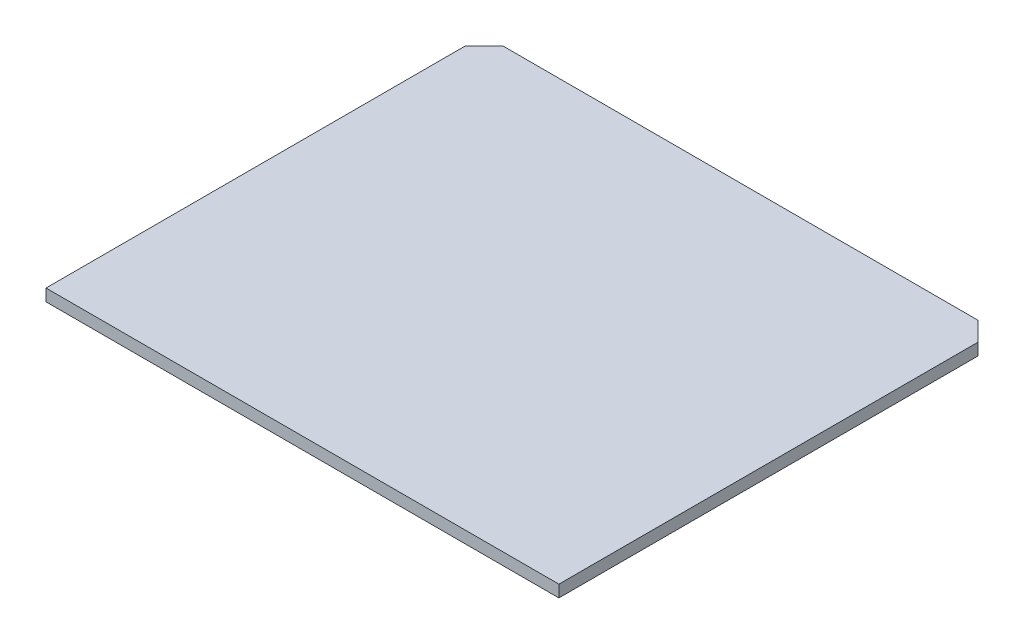
ISO-10303-21;
HEADER;
FILE_DESCRIPTION(('STEP AP214'),'2;1');
FILE_NAME('part.step','',(''),(''),'','','');
FILE_SCHEMA(('AUTOMOTIVE_DESIGN { 1 0 10303 214 1 1 1 1 }'));
ENDSEC;
DATA;
#1=APPLICATION_CONTEXT('core data for automotive mechanical design processes');
#2=APPLICATION_PROTOCOL_DEFINITION('international standard','automotive_design',2000,#1);
#3=PRODUCT_CONTEXT('',#1,'mechanical');
#4=PRODUCT('Part','Part','',(#3));
#5=PRODUCT_RELATED_PRODUCT_CATEGORY('part','',(#4));
#6=PRODUCT_DEFINITION_FORMATION('','',#4);
#7=PRODUCT_DEFINITION_CONTEXT('part definition',#1,'design');
#8=PRODUCT_DEFINITION('design','',#6,#7);
#9=PRODUCT_DEFINITION_SHAPE('','',#8);
#10=(LENGTH_UNIT() NAMED_UNIT(*) SI_UNIT(.MILLI.,.METRE.));
#11=(NAMED_UNIT(*) PLANE_ANGLE_UNIT() SI_UNIT($,.RADIAN.));
#12=(NAMED_UNIT(*) SI_UNIT($,.STERADIAN.) SOLID_ANGLE_UNIT());
#13=UNCERTAINTY_MEASURE_WITH_UNIT(LENGTH_MEASURE(1.E-05),#10,'distance_accuracy_value','');
#14=(GEOMETRIC_REPRESENTATION_CONTEXT(3) GLOBAL_UNCERTAINTY_ASSIGNED_CONTEXT((#13)) GLOBAL_UNIT_ASSIGNED_CONTEXT((#10,
#11,#12)) REPRESENTATION_CONTEXT('',''));
#15=CARTESIAN_POINT('',(0.,0.,0.));
#16=DIRECTION('',(0.,0.,1.));
#17=DIRECTION('',(1.,0.,0.));
#18=AXIS2_PLACEMENT_3D('',#15,#16,#17);
#19=CARTESIAN_POINT('',(34.29,1.6,-29.29));
#20=DIRECTION('',(-1.,0.,0.));
#21=DIRECTION('',(0.,0.,1.));
#22=AXIS2_PLACEMENT_3D('',#19,#20,#21);
#23=PLANE('',#22);
#24=DIRECTION('',(0.,0.,-1.));
#25=VECTOR('',#24,1.);
#26=CARTESIAN_POINT('',(34.29,0.,-29.29));
#27=LINE('',#26,#25);
#28=CARTESIAN_POINT('',(34.29,0.,29.29));
#29=VERTEX_POINT('',#28);
#30=CARTESIAN_POINT('',(34.29,0.,-26.75));
#31=VERTEX_POINT('',#30);
#32=EDGE_CURVE('E110',#29,#31,#27,.T.);
#33=ORIENTED_EDGE('',*,*,#32,.T.);
#34=DIRECTION('',(0.,1.,0.));
#35=VECTOR('',#34,1.);
#36=CARTESIAN_POINT('',(34.29,1.6,-26.75));
#37=LINE('',#36,#35);
#38=CARTESIAN_POINT('',(34.29,1.6,-26.75));
#39=VERTEX_POINT('',#38);
#40=EDGE_CURVE('E54',#31,#39,#37,.T.);
#41=ORIENTED_EDGE('',*,*,#40,.T.);
#42=DIRECTION('',(0.,0.,-1.));
#43=VECTOR('',#42,1.);
#44=CARTESIAN_POINT('',(34.29,1.6,-29.29));
#45=LINE('',#44,#43);
#46=CARTESIAN_POINT('',(34.29,1.6,29.29));
#47=VERTEX_POINT('',#46);
#48=EDGE_CURVE('E117',#47,#39,#45,.T.);
#49=ORIENTED_EDGE('',*,*,#48,.F.);
#50=DIRECTION('',(0.,-1.,0.));
#51=VECTOR('',#50,1.);
#52=CARTESIAN_POINT('',(34.29,1.6,29.29));
#53=LINE('',#52,#51);
#54=EDGE_CURVE('E102',#47,#29,#53,.T.);
#55=ORIENTED_EDGE('',*,*,#54,.T.);
#56=EDGE_LOOP('',(#33,#41,#49,#55));
#57=FACE_BOUND('',#56,.T.);
#58=ADVANCED_FACE('F31',(#57),#23,.F.);
#59=CARTESIAN_POINT('',(-34.29,1.6,-29.29));
#60=DIRECTION('',(0.,0.,1.));
#61=DIRECTION('',(1.,0.,0.));
#62=AXIS2_PLACEMENT_3D('',#59,#60,#61);
#63=PLANE('',#62);
#64=DIRECTION('',(-1.,0.,0.));
#65=VECTOR('',#64,1.);
#66=CARTESIAN_POINT('',(-34.29,1.6,-29.29));
#67=LINE('',#66,#65);
#68=CARTESIAN_POINT('',(31.75,1.6,-29.29));
#69=VERTEX_POINT('',#68);
#70=CARTESIAN_POINT('',(-31.75,1.6,-29.29));
#71=VERTEX_POINT('',#70);
#72=EDGE_CURVE('E92',#69,#71,#67,.T.);
#73=ORIENTED_EDGE('',*,*,#72,.F.);
#74=DIRECTION('',(0.,-1.,0.));
#75=VECTOR('',#74,1.);
#76=CARTESIAN_POINT('',(31.75,1.6,-29.29));
#77=LINE('',#76,#75);
#78=CARTESIAN_POINT('',(31.75,0.,-29.29));
#79=VERTEX_POINT('',#78);
#80=EDGE_CURVE('E120',#69,#79,#77,.T.);
#81=ORIENTED_EDGE('',*,*,#80,.T.);
#82=DIRECTION('',(-1.,0.,0.));
#83=VECTOR('',#82,1.);
#84=CARTESIAN_POINT('',(-34.29,0.,-29.29));
#85=LINE('',#84,#83);
#86=CARTESIAN_POINT('',(-31.75,0.,-29.29));
#87=VERTEX_POINT('',#86);
#88=EDGE_CURVE('E112',#79,#87,#85,.T.);
#89=ORIENTED_EDGE('',*,*,#88,.T.);
#90=DIRECTION('',(0.,1.,0.));
#91=VECTOR('',#90,1.);
#92=CARTESIAN_POINT('',(-31.75,1.6,-29.29));
#93=LINE('',#92,#91);
#94=EDGE_CURVE('E101',#87,#71,#93,.T.);
#95=ORIENTED_EDGE('',*,*,#94,.T.);
#96=EDGE_LOOP('',(#73,#81,#89,#95));
#97=FACE_BOUND('',#96,.T.);
#98=ADVANCED_FACE('F133',(#97),#63,.F.);
#99=CARTESIAN_POINT('',(-34.29,1.6,-29.29));
#100=DIRECTION('',(1.,0.,0.));
#101=DIRECTION('',(0.,0.,-1.));
#102=AXIS2_PLACEMENT_3D('',#99,#100,#101);
#103=PLANE('',#102);
#104=DIRECTION('',(0.,0.,1.));
#105=VECTOR('',#104,1.);
#106=CARTESIAN_POINT('',(-34.29,1.6,-29.29));
#107=LINE('',#106,#105);
#108=CARTESIAN_POINT('',(-34.29,1.6,-26.75));
#109=VERTEX_POINT('',#108);
#110=CARTESIAN_POINT('',(-34.29,1.6,29.29));
#111=VERTEX_POINT('',#110);
#112=EDGE_CURVE('E84',#109,#111,#107,.T.);
#113=ORIENTED_EDGE('',*,*,#112,.F.);
#114=DIRECTION('',(0.,-1.,0.));
#115=VECTOR('',#114,1.);
#116=CARTESIAN_POINT('',(-34.29,1.6,-26.75));
#117=LINE('',#116,#115);
#118=CARTESIAN_POINT('',(-34.29,0.,-26.75));
#119=VERTEX_POINT('',#118);
#120=EDGE_CURVE('E11',#109,#119,#117,.T.);
#121=ORIENTED_EDGE('',*,*,#120,.T.);
#122=DIRECTION('',(0.,0.,1.));
#123=VECTOR('',#122,1.);
#124=CARTESIAN_POINT('',(-34.29,0.,-29.29));
#125=LINE('',#124,#123);
#126=CARTESIAN_POINT('',(-34.29,0.,29.29));
#127=VERTEX_POINT('',#126);
#128=EDGE_CURVE('E98',#119,#127,#125,.T.);
#129=ORIENTED_EDGE('',*,*,#128,.T.);
#130=DIRECTION('',(0.,-1.,0.));
#131=VECTOR('',#130,1.);
#132=CARTESIAN_POINT('',(-34.29,1.6,29.29));
#133=LINE('',#132,#131);
#134=EDGE_CURVE('E95',#111,#127,#133,.T.);
#135=ORIENTED_EDGE('',*,*,#134,.F.);
#136=EDGE_LOOP('',(#113,#121,#129,#135));
#137=FACE_BOUND('',#136,.T.);
#138=ADVANCED_FACE('F96',(#137),#103,.F.);
#139=CARTESIAN_POINT('',(-34.29,1.6,29.29));
#140=DIRECTION('',(0.,0.,-1.));
#141=DIRECTION('',(-1.,0.,0.));
#142=AXIS2_PLACEMENT_3D('',#139,#140,#141);
#143=PLANE('',#142);
#144=DIRECTION('',(1.,0.,0.));
#145=VECTOR('',#144,1.);
#146=CARTESIAN_POINT('',(-34.29,0.,29.29));
#147=LINE('',#146,#145);
#148=EDGE_CURVE('E116',#127,#29,#147,.T.);
#149=ORIENTED_EDGE('',*,*,#148,.T.);
#150=ORIENTED_EDGE('',*,*,#54,.F.);
#151=DIRECTION('',(1.,0.,0.));
#152=VECTOR('',#151,1.);
#153=CARTESIAN_POINT('',(-34.29,1.6,29.29));
#154=LINE('',#153,#152);
#155=EDGE_CURVE('E88',#111,#47,#154,.T.);
#156=ORIENTED_EDGE('',*,*,#155,.F.);
#157=ORIENTED_EDGE('',*,*,#134,.T.);
#158=EDGE_LOOP('',(#149,#150,#156,#157));
#159=FACE_BOUND('',#158,.T.);
#160=ADVANCED_FACE('F104',(#159),#143,.F.);
#161=CARTESIAN_POINT('',(34.29,1.6,29.29));
#162=DIRECTION('',(0.,1.,0.));
#163=DIRECTION('',(0.,0.,1.));
#164=AXIS2_PLACEMENT_3D('',#161,#162,#163);
#165=PLANE('',#164);
#166=ORIENTED_EDGE('',*,*,#48,.T.);
#167=DIRECTION('',(0.707106781186548,0.,0.707106781186548));
#168=VECTOR('',#167,1.);
#169=CARTESIAN_POINT('',(62.31,1.6,1.27000000000002));
#170=LINE('',#169,#168);
#171=EDGE_CURVE('E39',#39,#69,#170,.F.);
#172=ORIENTED_EDGE('',*,*,#171,.T.);
#173=ORIENTED_EDGE('',*,*,#72,.T.);
#174=DIRECTION('',(0.70710678118655,0.,-0.707106781186546));
#175=VECTOR('',#174,1.);
#176=CARTESIAN_POINT('',(-28.0199999999998,1.6,-33.0200000000002));
#177=LINE('',#176,#175);
#178=EDGE_CURVE('E46',#71,#109,#177,.F.);
#179=ORIENTED_EDGE('',*,*,#178,.T.);
#180=ORIENTED_EDGE('',*,*,#112,.T.);
#181=ORIENTED_EDGE('',*,*,#155,.T.);
#182=EDGE_LOOP('',(#166,#172,#173,#179,#180,#181));
#183=FACE_BOUND('',#182,.T.);
#184=ADVANCED_FACE('F86',(#183),#165,.T.);
#185=CARTESIAN_POINT('',(34.29,0.,29.29));
#186=DIRECTION('',(0.,1.,0.));
#187=DIRECTION('',(0.,0.,1.));
#188=AXIS2_PLACEMENT_3D('',#185,#186,#187);
#189=PLANE('',#188);
#190=ORIENTED_EDGE('',*,*,#88,.F.);
#191=DIRECTION('',(-0.707106781186548,0.,-0.707106781186548));
#192=VECTOR('',#191,1.);
#193=CARTESIAN_POINT('',(31.75,0.,-29.29));
#194=LINE('',#193,#192);
#195=EDGE_CURVE('E125',#79,#31,#194,.F.);
#196=ORIENTED_EDGE('',*,*,#195,.T.);
#197=ORIENTED_EDGE('',*,*,#32,.F.);
#198=ORIENTED_EDGE('',*,*,#148,.F.);
#199=ORIENTED_EDGE('',*,*,#128,.F.);
#200=DIRECTION('',(-0.70710678118655,0.,0.707106781186546));
#201=VECTOR('',#200,1.);
#202=CARTESIAN_POINT('',(-34.29,0.,-26.75));
#203=LINE('',#202,#201);
#204=EDGE_CURVE('E123',#119,#87,#203,.F.);
#205=ORIENTED_EDGE('',*,*,#204,.T.);
#206=EDGE_LOOP('',(#190,#196,#197,#198,#199,#205));
#207=FACE_BOUND('',#206,.T.);
#208=ADVANCED_FACE('F139',(#207),#189,.F.);
#209=CARTESIAN_POINT('',(31.75,1.6,-29.29));
#210=DIRECTION('',(-0.707106781186547,0.,0.707106781186547));
#211=DIRECTION('',(0.707106781186548,0.,0.707106781186548));
#212=AXIS2_PLACEMENT_3D('',#209,#210,#211);
#213=PLANE('',#212);
#214=ORIENTED_EDGE('',*,*,#171,.F.);
#215=ORIENTED_EDGE('',*,*,#40,.F.);
#216=ORIENTED_EDGE('',*,*,#195,.F.);
#217=ORIENTED_EDGE('',*,*,#80,.F.);
#218=EDGE_LOOP('',(#214,#215,#216,#217));
#219=FACE_BOUND('',#218,.T.);
#220=ADVANCED_FACE('F136',(#219),#213,.F.);
#221=CARTESIAN_POINT('',(-34.29,1.6,-26.75));
#222=DIRECTION('',(0.707106781186546,0.,0.70710678118655));
#223=DIRECTION('',(0.70710678118655,0.,-0.707106781186546));
#224=AXIS2_PLACEMENT_3D('',#221,#222,#223);
#225=PLANE('',#224);
#226=ORIENTED_EDGE('',*,*,#178,.F.);
#227=ORIENTED_EDGE('',*,*,#94,.F.);
#228=ORIENTED_EDGE('',*,*,#204,.F.);
#229=ORIENTED_EDGE('',*,*,#120,.F.);
#230=EDGE_LOOP('',(#226,#227,#228,#229));
#231=FACE_BOUND('',#230,.T.);
#232=ADVANCED_FACE('F33',(#231),#225,.F.);
#233=CLOSED_SHELL('',(#58,#98,#138,#160,#184,#208,#220,#232));
#234=MANIFOLD_SOLID_BREP('B2',#233);
#235=ADVANCED_BREP_SHAPE_REPRESENTATION('',(#18,#234),#14);
#236=SHAPE_DEFINITION_REPRESENTATION(#9,#235);
ENDSEC;
END-ISO-10303-21;
